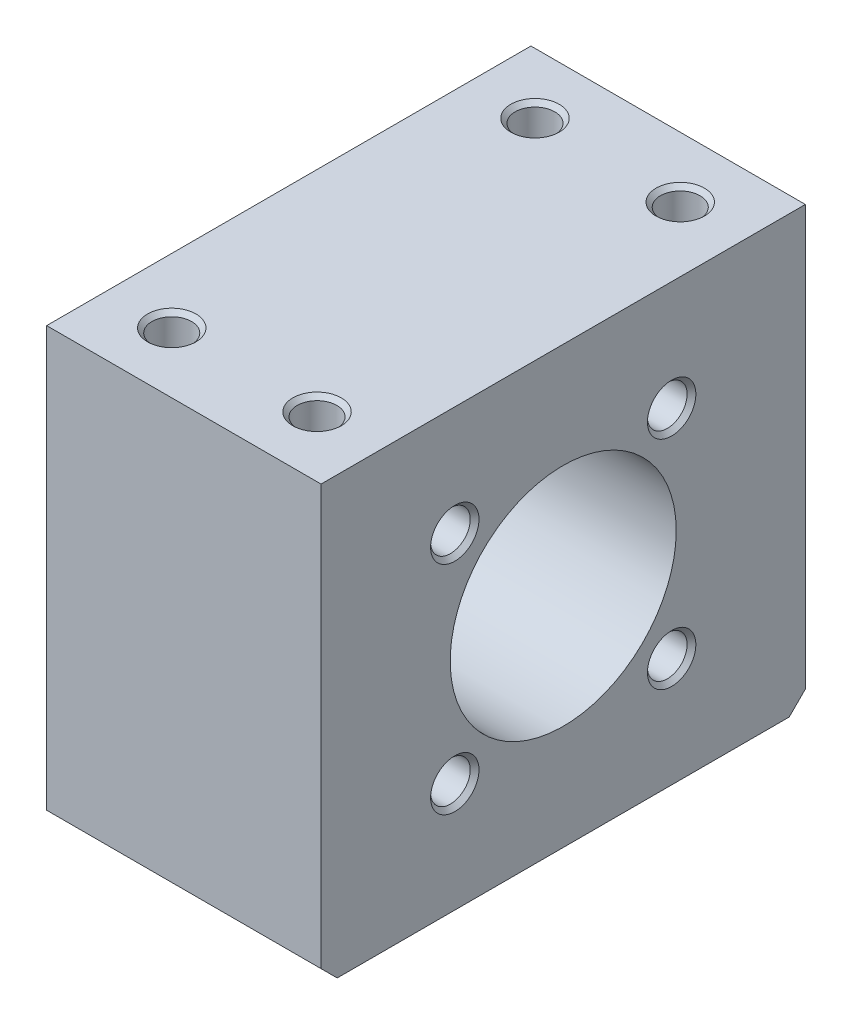
ISO-10303-21;
HEADER;
FILE_DESCRIPTION(('STEP AP214'),'2;1');
FILE_NAME('part.step','',(''),(''),'','','');
FILE_SCHEMA(('AUTOMOTIVE_DESIGN { 1 0 10303 214 1 1 1 1 }'));
ENDSEC;
DATA;
#1=APPLICATION_CONTEXT('core data for automotive mechanical design processes');
#2=APPLICATION_PROTOCOL_DEFINITION('international standard','automotive_design',2000,#1);
#3=PRODUCT_CONTEXT('',#1,'mechanical');
#4=PRODUCT('Part','Part','',(#3));
#5=PRODUCT_RELATED_PRODUCT_CATEGORY('part','',(#4));
#6=PRODUCT_DEFINITION_FORMATION('','',#4);
#7=PRODUCT_DEFINITION_CONTEXT('part definition',#1,'design');
#8=PRODUCT_DEFINITION('design','',#6,#7);
#9=PRODUCT_DEFINITION_SHAPE('','',#8);
#10=(LENGTH_UNIT() NAMED_UNIT(*) SI_UNIT(.MILLI.,.METRE.));
#11=(NAMED_UNIT(*) PLANE_ANGLE_UNIT() SI_UNIT($,.RADIAN.));
#12=(NAMED_UNIT(*) SI_UNIT($,.STERADIAN.) SOLID_ANGLE_UNIT());
#13=UNCERTAINTY_MEASURE_WITH_UNIT(LENGTH_MEASURE(1.E-05),#10,'distance_accuracy_value','');
#14=(GEOMETRIC_REPRESENTATION_CONTEXT(3) GLOBAL_UNCERTAINTY_ASSIGNED_CONTEXT((#13)) GLOBAL_UNIT_ASSIGNED_CONTEXT((#10,
#11,#12)) REPRESENTATION_CONTEXT('',''));
#15=CARTESIAN_POINT('',(0.,0.,0.));
#16=DIRECTION('',(0.,0.,1.));
#17=DIRECTION('',(1.,0.,0.));
#18=AXIS2_PLACEMENT_3D('',#15,#16,#17);
#19=CARTESIAN_POINT('',(-17.,-27.,30.));
#20=DIRECTION('',(0.,-1.,0.));
#21=DIRECTION('',(0.,0.,-1.));
#22=AXIS2_PLACEMENT_3D('',#19,#20,#21);
#23=PLANE('',#22);
#24=DIRECTION('',(0.,0.,-1.));
#25=VECTOR('',#24,1.);
#26=CARTESIAN_POINT('',(17.,-27.,30.));
#27=LINE('',#26,#25);
#28=CARTESIAN_POINT('',(17.,-27.,28.));
#29=VERTEX_POINT('',#28);
#30=CARTESIAN_POINT('',(17.,-27.,-28.));
#31=VERTEX_POINT('',#30);
#32=EDGE_CURVE('E149',#29,#31,#27,.T.);
#33=ORIENTED_EDGE('',*,*,#32,.F.);
#34=DIRECTION('',(-1.,0.,0.));
#35=VECTOR('',#34,1.);
#36=CARTESIAN_POINT('',(-17.,-27.,28.));
#37=LINE('',#36,#35);
#38=CARTESIAN_POINT('',(-17.,-27.,28.));
#39=VERTEX_POINT('',#38);
#40=EDGE_CURVE('E233',#29,#39,#37,.T.);
#41=ORIENTED_EDGE('',*,*,#40,.T.);
#42=DIRECTION('',(0.,0.,-1.));
#43=VECTOR('',#42,1.);
#44=CARTESIAN_POINT('',(-17.,-27.,30.));
#45=LINE('',#44,#43);
#46=CARTESIAN_POINT('',(-17.,-27.,-28.));
#47=VERTEX_POINT('',#46);
#48=EDGE_CURVE('E150',#39,#47,#45,.T.);
#49=ORIENTED_EDGE('',*,*,#48,.T.);
#50=DIRECTION('',(1.,0.,0.));
#51=VECTOR('',#50,1.);
#52=CARTESIAN_POINT('',(-17.,-27.,-28.));
#53=LINE('',#52,#51);
#54=EDGE_CURVE('E230',#47,#31,#53,.T.);
#55=ORIENTED_EDGE('',*,*,#54,.T.);
#56=EDGE_LOOP('',(#33,#41,#49,#55));
#57=FACE_BOUND('',#56,.T.);
#58=ADVANCED_FACE('F35',(#57),#23,.T.);
#59=CARTESIAN_POINT('',(-17.,27.,30.));
#60=DIRECTION('',(0.,0.,1.));
#61=DIRECTION('',(1.,0.,0.));
#62=AXIS2_PLACEMENT_3D('',#59,#60,#61);
#63=PLANE('',#62);
#64=DIRECTION('',(0.,-1.,0.));
#65=VECTOR('',#64,1.);
#66=CARTESIAN_POINT('',(-17.,27.,30.));
#67=LINE('',#66,#65);
#68=CARTESIAN_POINT('',(-17.,27.,30.));
#69=VERTEX_POINT('',#68);
#70=CARTESIAN_POINT('',(-17.,-25.,30.));
#71=VERTEX_POINT('',#70);
#72=EDGE_CURVE('E158',#69,#71,#67,.T.);
#73=ORIENTED_EDGE('',*,*,#72,.T.);
#74=DIRECTION('',(1.,0.,0.));
#75=VECTOR('',#74,1.);
#76=CARTESIAN_POINT('',(-17.,-25.,30.));
#77=LINE('',#76,#75);
#78=CARTESIAN_POINT('',(17.,-25.,30.));
#79=VERTEX_POINT('',#78);
#80=EDGE_CURVE('E223',#71,#79,#77,.T.);
#81=ORIENTED_EDGE('',*,*,#80,.T.);
#82=DIRECTION('',(0.,-1.,0.));
#83=VECTOR('',#82,1.);
#84=CARTESIAN_POINT('',(17.,27.,30.));
#85=LINE('',#84,#83);
#86=CARTESIAN_POINT('',(17.,27.,30.));
#87=VERTEX_POINT('',#86);
#88=EDGE_CURVE('E153',#87,#79,#85,.T.);
#89=ORIENTED_EDGE('',*,*,#88,.F.);
#90=DIRECTION('',(1.,0.,0.));
#91=VECTOR('',#90,1.);
#92=CARTESIAN_POINT('',(-17.,27.,30.));
#93=LINE('',#92,#91);
#94=EDGE_CURVE('E171',#69,#87,#93,.T.);
#95=ORIENTED_EDGE('',*,*,#94,.F.);
#96=EDGE_LOOP('',(#73,#81,#89,#95));
#97=FACE_BOUND('',#96,.T.);
#98=ADVANCED_FACE('F243',(#97),#63,.T.);
#99=CARTESIAN_POINT('',(-17.,27.,-30.));
#100=DIRECTION('',(0.,1.,0.));
#101=DIRECTION('',(0.,0.,1.));
#102=AXIS2_PLACEMENT_3D('',#99,#100,#101);
#103=PLANE('',#102);
#104=CARTESIAN_POINT('',(-9.,27.,22.5));
#105=DIRECTION('',(0.,1.,0.));
#106=DIRECTION('',(0.,0.,1.));
#107=AXIS2_PLACEMENT_3D('',#104,#105,#106);
#108=CIRCLE('',#107,3.00000000005393);
#109=CARTESIAN_POINT('',(-9.,27.,25.5000000000539));
#110=VERTEX_POINT('',#109);
#111=EDGE_CURVE('E187',#110,#110,#108,.F.);
#112=ORIENTED_EDGE('',*,*,#111,.T.);
#113=EDGE_LOOP('',(#112));
#114=FACE_BOUND('',#113,.T.);
#115=CARTESIAN_POINT('',(9.,27.,22.5));
#116=DIRECTION('',(0.,1.,0.));
#117=DIRECTION('',(0.,0.,1.));
#118=AXIS2_PLACEMENT_3D('',#115,#116,#117);
#119=CIRCLE('',#118,3.00000000005393);
#120=CARTESIAN_POINT('',(9.,27.,25.5000000000539));
#121=VERTEX_POINT('',#120);
#122=EDGE_CURVE('E184',#121,#121,#119,.F.);
#123=ORIENTED_EDGE('',*,*,#122,.T.);
#124=EDGE_LOOP('',(#123));
#125=FACE_BOUND('',#124,.T.);
#126=CARTESIAN_POINT('',(-9.,27.,-22.5));
#127=DIRECTION('',(0.,1.,0.));
#128=DIRECTION('',(0.,0.,1.));
#129=AXIS2_PLACEMENT_3D('',#126,#127,#128);
#130=CIRCLE('',#129,3.00000000005393);
#131=CARTESIAN_POINT('',(-9.,27.,-19.4999999999461));
#132=VERTEX_POINT('',#131);
#133=EDGE_CURVE('E181',#132,#132,#130,.F.);
#134=ORIENTED_EDGE('',*,*,#133,.T.);
#135=EDGE_LOOP('',(#134));
#136=FACE_BOUND('',#135,.T.);
#137=CARTESIAN_POINT('',(9.,27.,-22.5));
#138=DIRECTION('',(0.,1.,0.));
#139=DIRECTION('',(0.,0.,1.));
#140=AXIS2_PLACEMENT_3D('',#137,#138,#139);
#141=CIRCLE('',#140,3.00000000005393);
#142=CARTESIAN_POINT('',(9.,27.,-19.4999999999461));
#143=VERTEX_POINT('',#142);
#144=EDGE_CURVE('E178',#143,#143,#141,.F.);
#145=ORIENTED_EDGE('',*,*,#144,.T.);
#146=EDGE_LOOP('',(#145));
#147=FACE_BOUND('',#146,.T.);
#148=DIRECTION('',(0.,0.,1.));
#149=VECTOR('',#148,1.);
#150=CARTESIAN_POINT('',(17.,27.,-30.));
#151=LINE('',#150,#149);
#152=CARTESIAN_POINT('',(17.,27.,-30.));
#153=VERTEX_POINT('',#152);
#154=EDGE_CURVE('E166',#153,#87,#151,.T.);
#155=ORIENTED_EDGE('',*,*,#154,.F.);
#156=DIRECTION('',(1.,0.,0.));
#157=VECTOR('',#156,1.);
#158=CARTESIAN_POINT('',(-17.,27.,-30.));
#159=LINE('',#158,#157);
#160=CARTESIAN_POINT('',(-17.,27.,-30.));
#161=VERTEX_POINT('',#160);
#162=EDGE_CURVE('E161',#161,#153,#159,.T.);
#163=ORIENTED_EDGE('',*,*,#162,.F.);
#164=DIRECTION('',(0.,0.,1.));
#165=VECTOR('',#164,1.);
#166=CARTESIAN_POINT('',(-17.,27.,-30.));
#167=LINE('',#166,#165);
#168=EDGE_CURVE('E155',#161,#69,#167,.T.);
#169=ORIENTED_EDGE('',*,*,#168,.T.);
#170=ORIENTED_EDGE('',*,*,#94,.T.);
#171=EDGE_LOOP('',(#155,#163,#169,#170));
#172=FACE_BOUND('',#171,.T.);
#173=ADVANCED_FACE('F256',(#114,#125,#136,#147,#172),#103,.T.);
#174=CARTESIAN_POINT('',(-17.,-27.,-30.));
#175=DIRECTION('',(0.,0.,-1.));
#176=DIRECTION('',(-1.,0.,0.));
#177=AXIS2_PLACEMENT_3D('',#174,#175,#176);
#178=PLANE('',#177);
#179=DIRECTION('',(0.,1.,0.));
#180=VECTOR('',#179,1.);
#181=CARTESIAN_POINT('',(17.,-27.,-30.));
#182=LINE('',#181,#180);
#183=CARTESIAN_POINT('',(17.,-25.,-30.));
#184=VERTEX_POINT('',#183);
#185=EDGE_CURVE('E164',#184,#153,#182,.T.);
#186=ORIENTED_EDGE('',*,*,#185,.F.);
#187=DIRECTION('',(-1.,0.,0.));
#188=VECTOR('',#187,1.);
#189=CARTESIAN_POINT('',(-17.,-25.,-30.));
#190=LINE('',#189,#188);
#191=CARTESIAN_POINT('',(-17.,-25.,-30.));
#192=VERTEX_POINT('',#191);
#193=EDGE_CURVE('E11',#184,#192,#190,.T.);
#194=ORIENTED_EDGE('',*,*,#193,.T.);
#195=DIRECTION('',(0.,1.,0.));
#196=VECTOR('',#195,1.);
#197=CARTESIAN_POINT('',(-17.,-27.,-30.));
#198=LINE('',#197,#196);
#199=EDGE_CURVE('E152',#192,#161,#198,.T.);
#200=ORIENTED_EDGE('',*,*,#199,.T.);
#201=ORIENTED_EDGE('',*,*,#162,.T.);
#202=EDGE_LOOP('',(#186,#194,#200,#201));
#203=FACE_BOUND('',#202,.T.);
#204=ADVANCED_FACE('F252',(#203),#178,.T.);
#205=CARTESIAN_POINT('',(-17.,0.,0.));
#206=DIRECTION('',(1.,0.,0.));
#207=DIRECTION('',(0.,0.,-1.));
#208=AXIS2_PLACEMENT_3D('',#205,#206,#207);
#209=PLANE('',#208);
#210=CARTESIAN_POINT('',(-17.,0.,0.));
#211=DIRECTION('',(1.,0.,0.));
#212=DIRECTION('',(0.,0.,-1.));
#213=AXIS2_PLACEMENT_3D('',#210,#211,#212);
#214=CIRCLE('',#213,14.);
#215=CARTESIAN_POINT('',(-17.,0.,-14.));
#216=VERTEX_POINT('',#215);
#217=EDGE_CURVE('E146',#216,#216,#214,.T.);
#218=ORIENTED_EDGE('',*,*,#217,.T.);
#219=EDGE_LOOP('',(#218));
#220=FACE_BOUND('',#219,.T.);
#221=ORIENTED_EDGE('',*,*,#48,.F.);
#222=DIRECTION('',(0.,-0.707106781186544,-0.707106781186551));
#223=VECTOR('',#222,1.);
#224=CARTESIAN_POINT('',(-17.,-25.,30.));
#225=LINE('',#224,#223);
#226=EDGE_CURVE('E43',#39,#71,#225,.F.);
#227=ORIENTED_EDGE('',*,*,#226,.T.);
#228=ORIENTED_EDGE('',*,*,#72,.F.);
#229=ORIENTED_EDGE('',*,*,#168,.F.);
#230=ORIENTED_EDGE('',*,*,#199,.F.);
#231=DIRECTION('',(0.,0.707106781186551,-0.707106781186544));
#232=VECTOR('',#231,1.);
#233=CARTESIAN_POINT('',(-17.,-27.,-28.));
#234=LINE('',#233,#232);
#235=EDGE_CURVE('E55',#192,#47,#234,.F.);
#236=ORIENTED_EDGE('',*,*,#235,.T.);
#237=EDGE_LOOP('',(#221,#227,#228,#229,#230,#236));
#238=FACE_BOUND('',#237,.T.);
#239=ADVANCED_FACE('F237',(#220,#238),#209,.F.);
#240=CARTESIAN_POINT('',(17.,0.,0.));
#241=DIRECTION('',(1.,0.,0.));
#242=DIRECTION('',(0.,0.,-1.));
#243=AXIS2_PLACEMENT_3D('',#240,#241,#242);
#244=PLANE('',#243);
#245=CARTESIAN_POINT('',(17.,-13.4350288425444,13.4350288425444));
#246=DIRECTION('',(1.,0.,0.));
#247=DIRECTION('',(0.,0.,-1.));
#248=AXIS2_PLACEMENT_3D('',#245,#246,#247);
#249=CIRCLE('',#248,3.00000000005394);
#250=CARTESIAN_POINT('',(17.,-13.4350288425444,10.4350288424905));
#251=VERTEX_POINT('',#250);
#252=EDGE_CURVE('E205',#251,#251,#249,.F.);
#253=ORIENTED_EDGE('',*,*,#252,.T.);
#254=EDGE_LOOP('',(#253));
#255=FACE_BOUND('',#254,.T.);
#256=CARTESIAN_POINT('',(17.,-13.4350288425444,-13.4350288425444));
#257=DIRECTION('',(1.,0.,0.));
#258=DIRECTION('',(0.,0.,-1.));
#259=AXIS2_PLACEMENT_3D('',#256,#257,#258);
#260=CIRCLE('',#259,3.00000000005392);
#261=CARTESIAN_POINT('',(17.,-13.4350288425444,-16.4350288425983));
#262=VERTEX_POINT('',#261);
#263=EDGE_CURVE('E202',#262,#262,#260,.F.);
#264=ORIENTED_EDGE('',*,*,#263,.T.);
#265=EDGE_LOOP('',(#264));
#266=FACE_BOUND('',#265,.T.);
#267=CARTESIAN_POINT('',(17.,13.4350288425444,13.4350288425444));
#268=DIRECTION('',(1.,0.,0.));
#269=DIRECTION('',(0.,0.,-1.));
#270=AXIS2_PLACEMENT_3D('',#267,#268,#269);
#271=CIRCLE('',#270,3.00000000005394);
#272=CARTESIAN_POINT('',(17.,13.4350288425444,10.4350288424905));
#273=VERTEX_POINT('',#272);
#274=EDGE_CURVE('E199',#273,#273,#271,.F.);
#275=ORIENTED_EDGE('',*,*,#274,.T.);
#276=EDGE_LOOP('',(#275));
#277=FACE_BOUND('',#276,.T.);
#278=CARTESIAN_POINT('',(17.,13.4350288425444,-13.4350288425444));
#279=DIRECTION('',(1.,0.,0.));
#280=DIRECTION('',(0.,0.,-1.));
#281=AXIS2_PLACEMENT_3D('',#278,#279,#280);
#282=CIRCLE('',#281,3.00000000005392);
#283=CARTESIAN_POINT('',(17.,13.4350288425444,-16.4350288425983));
#284=VERTEX_POINT('',#283);
#285=EDGE_CURVE('E196',#284,#284,#282,.F.);
#286=ORIENTED_EDGE('',*,*,#285,.T.);
#287=EDGE_LOOP('',(#286));
#288=FACE_BOUND('',#287,.T.);
#289=CARTESIAN_POINT('',(17.,0.,0.));
#290=DIRECTION('',(1.,0.,0.));
#291=DIRECTION('',(0.,0.,-1.));
#292=AXIS2_PLACEMENT_3D('',#289,#290,#291);
#293=CIRCLE('',#292,14.);
#294=CARTESIAN_POINT('',(17.,0.,-14.));
#295=VERTEX_POINT('',#294);
#296=EDGE_CURVE('E143',#295,#295,#293,.T.);
#297=ORIENTED_EDGE('',*,*,#296,.F.);
#298=EDGE_LOOP('',(#297));
#299=FACE_BOUND('',#298,.T.);
#300=ORIENTED_EDGE('',*,*,#88,.T.);
#301=DIRECTION('',(0.,0.707106781186544,0.707106781186551));
#302=VECTOR('',#301,1.);
#303=CARTESIAN_POINT('',(17.,-27.5000000000001,27.4999999999999));
#304=LINE('',#303,#302);
#305=EDGE_CURVE('E228',#79,#29,#304,.F.);
#306=ORIENTED_EDGE('',*,*,#305,.T.);
#307=ORIENTED_EDGE('',*,*,#32,.T.);
#308=DIRECTION('',(0.,-0.707106781186551,0.707106781186544));
#309=VECTOR('',#308,1.);
#310=CARTESIAN_POINT('',(17.,-27.4999999999999,-27.5000000000002));
#311=LINE('',#310,#309);
#312=EDGE_CURVE('E226',#31,#184,#311,.F.);
#313=ORIENTED_EDGE('',*,*,#312,.T.);
#314=ORIENTED_EDGE('',*,*,#185,.T.);
#315=ORIENTED_EDGE('',*,*,#154,.T.);
#316=EDGE_LOOP('',(#300,#306,#307,#313,#314,#315));
#317=FACE_BOUND('',#316,.T.);
#318=ADVANCED_FACE('F248',(#255,#266,#277,#288,#299,#317),#244,.T.);
#319=CARTESIAN_POINT('',(17.,0.,0.));
#320=DIRECTION('',(1.,0.,0.));
#321=DIRECTION('',(0.,0.,-1.));
#322=AXIS2_PLACEMENT_3D('',#319,#320,#321);
#323=CYLINDRICAL_SURFACE('',#322,14.);
#324=ORIENTED_EDGE('',*,*,#217,.F.);
#325=EDGE_LOOP('',(#324));
#326=FACE_BOUND('',#325,.T.);
#327=ORIENTED_EDGE('',*,*,#296,.T.);
#328=EDGE_LOOP('',(#327));
#329=FACE_BOUND('',#328,.T.);
#330=ADVANCED_FACE('F323',(#326,#329),#323,.F.);
#331=CARTESIAN_POINT('',(-9.,12.6873648292338,22.5));
#332=DIRECTION('',(0.,1.,0.));
#333=DIRECTION('',(0.,0.,1.));
#334=AXIS2_PLACEMENT_3D('',#331,#332,#333);
#335=CONICAL_SURFACE('',#334,2.4585,1.04719755108975);
#336=CARTESIAN_POINT('',(-9.,11.2679491920809,22.5));
#337=VERTEX_POINT('',#336);
#338=VERTEX_LOOP('',#337);
#339=FACE_BOUND('',#338,.T.);
#340=CARTESIAN_POINT('',(-9.,12.6873648292338,22.5));
#341=DIRECTION('',(0.,1.,0.));
#342=DIRECTION('',(0.,0.,1.));
#343=AXIS2_PLACEMENT_3D('',#340,#341,#342);
#344=CIRCLE('',#343,2.4585);
#345=CARTESIAN_POINT('',(-9.,12.6873648292338,24.9585));
#346=VERTEX_POINT('',#345);
#347=EDGE_CURVE('E140',#346,#346,#344,.T.);
#348=ORIENTED_EDGE('',*,*,#347,.T.);
#349=EDGE_LOOP('',(#348));
#350=FACE_BOUND('',#349,.T.);
#351=ADVANCED_FACE('F495',(#339,#350),#335,.F.);
#352=CARTESIAN_POINT('',(-9.,27.,22.5));
#353=DIRECTION('',(0.,1.,0.));
#354=DIRECTION('',(0.,0.,1.));
#355=AXIS2_PLACEMENT_3D('',#352,#353,#354);
#356=CYLINDRICAL_SURFACE('',#355,2.4585);
#357=CARTESIAN_POINT('',(-9.,26.4584999999461,22.5));
#358=DIRECTION('',(0.,1.,0.));
#359=DIRECTION('',(0.,0.,1.));
#360=AXIS2_PLACEMENT_3D('',#357,#358,#359);
#361=CIRCLE('',#360,2.4585);
#362=CARTESIAN_POINT('',(-9.,26.4584999999461,24.9585));
#363=VERTEX_POINT('',#362);
#364=EDGE_CURVE('E173',#363,#363,#361,.T.);
#365=ORIENTED_EDGE('',*,*,#364,.T.);
#366=EDGE_LOOP('',(#365));
#367=FACE_BOUND('',#366,.T.);
#368=ORIENTED_EDGE('',*,*,#347,.F.);
#369=EDGE_LOOP('',(#368));
#370=FACE_BOUND('',#369,.T.);
#371=ADVANCED_FACE('F491',(#367,#370),#356,.F.);
#372=CARTESIAN_POINT('',(-9.,12.6873648292338,-22.5));
#373=DIRECTION('',(0.,1.,0.));
#374=DIRECTION('',(0.,0.,1.));
#375=AXIS2_PLACEMENT_3D('',#372,#373,#374);
#376=CONICAL_SURFACE('',#375,2.4585,1.04719755108975);
#377=CARTESIAN_POINT('',(-9.,11.2679491920809,-22.5));
#378=VERTEX_POINT('',#377);
#379=VERTEX_LOOP('',#378);
#380=FACE_BOUND('',#379,.T.);
#381=CARTESIAN_POINT('',(-9.,12.6873648292338,-22.5));
#382=DIRECTION('',(0.,1.,0.));
#383=DIRECTION('',(0.,0.,1.));
#384=AXIS2_PLACEMENT_3D('',#381,#382,#383);
#385=CIRCLE('',#384,2.4585);
#386=CARTESIAN_POINT('',(-9.,12.6873648292338,-20.0415));
#387=VERTEX_POINT('',#386);
#388=EDGE_CURVE('E137',#387,#387,#385,.T.);
#389=ORIENTED_EDGE('',*,*,#388,.T.);
#390=EDGE_LOOP('',(#389));
#391=FACE_BOUND('',#390,.T.);
#392=ADVANCED_FACE('F483',(#380,#391),#376,.F.);
#393=CARTESIAN_POINT('',(-9.,27.,-22.5));
#394=DIRECTION('',(0.,1.,0.));
#395=DIRECTION('',(0.,0.,1.));
#396=AXIS2_PLACEMENT_3D('',#393,#394,#395);
#397=CYLINDRICAL_SURFACE('',#396,2.4585);
#398=CARTESIAN_POINT('',(-9.,26.4584999999461,-22.5));
#399=DIRECTION('',(0.,1.,0.));
#400=DIRECTION('',(0.,0.,1.));
#401=AXIS2_PLACEMENT_3D('',#398,#399,#400);
#402=CIRCLE('',#401,2.4585);
#403=CARTESIAN_POINT('',(-9.,26.4584999999461,-20.0415));
#404=VERTEX_POINT('',#403);
#405=EDGE_CURVE('E208',#404,#404,#402,.T.);
#406=ORIENTED_EDGE('',*,*,#405,.T.);
#407=EDGE_LOOP('',(#406));
#408=FACE_BOUND('',#407,.T.);
#409=ORIENTED_EDGE('',*,*,#388,.F.);
#410=EDGE_LOOP('',(#409));
#411=FACE_BOUND('',#410,.T.);
#412=ADVANCED_FACE('F478',(#408,#411),#397,.F.);
#413=CARTESIAN_POINT('',(9.,12.6873648292338,22.5));
#414=DIRECTION('',(0.,1.,0.));
#415=DIRECTION('',(0.,0.,1.));
#416=AXIS2_PLACEMENT_3D('',#413,#414,#415);
#417=CONICAL_SURFACE('',#416,2.4585,1.04719755108975);
#418=CARTESIAN_POINT('',(9.,11.2679491920809,22.5));
#419=VERTEX_POINT('',#418);
#420=VERTEX_LOOP('',#419);
#421=FACE_BOUND('',#420,.T.);
#422=CARTESIAN_POINT('',(9.,12.6873648292338,22.5));
#423=DIRECTION('',(0.,1.,0.));
#424=DIRECTION('',(0.,0.,1.));
#425=AXIS2_PLACEMENT_3D('',#422,#423,#424);
#426=CIRCLE('',#425,2.4585);
#427=CARTESIAN_POINT('',(9.,12.6873648292338,24.9585));
#428=VERTEX_POINT('',#427);
#429=EDGE_CURVE('E134',#428,#428,#426,.T.);
#430=ORIENTED_EDGE('',*,*,#429,.T.);
#431=EDGE_LOOP('',(#430));
#432=FACE_BOUND('',#431,.T.);
#433=ADVANCED_FACE('F470',(#421,#432),#417,.F.);
#434=CARTESIAN_POINT('',(9.,27.,22.5));
#435=DIRECTION('',(0.,1.,0.));
#436=DIRECTION('',(0.,0.,1.));
#437=AXIS2_PLACEMENT_3D('',#434,#435,#436);
#438=CYLINDRICAL_SURFACE('',#437,2.4585);
#439=CARTESIAN_POINT('',(9.,26.4584999999461,22.5));
#440=DIRECTION('',(0.,1.,0.));
#441=DIRECTION('',(0.,0.,1.));
#442=AXIS2_PLACEMENT_3D('',#439,#440,#441);
#443=CIRCLE('',#442,2.4585);
#444=CARTESIAN_POINT('',(9.,26.4584999999461,24.9585));
#445=VERTEX_POINT('',#444);
#446=EDGE_CURVE('E190',#445,#445,#443,.T.);
#447=ORIENTED_EDGE('',*,*,#446,.T.);
#448=EDGE_LOOP('',(#447));
#449=FACE_BOUND('',#448,.T.);
#450=ORIENTED_EDGE('',*,*,#429,.F.);
#451=EDGE_LOOP('',(#450));
#452=FACE_BOUND('',#451,.T.);
#453=ADVANCED_FACE('F465',(#449,#452),#438,.F.);
#454=CARTESIAN_POINT('',(9.,12.6873648292338,-22.5));
#455=DIRECTION('',(0.,1.,0.));
#456=DIRECTION('',(0.,0.,1.));
#457=AXIS2_PLACEMENT_3D('',#454,#455,#456);
#458=CONICAL_SURFACE('',#457,2.4585,1.04719755108975);
#459=CARTESIAN_POINT('',(9.,11.2679491920809,-22.5));
#460=VERTEX_POINT('',#459);
#461=VERTEX_LOOP('',#460);
#462=FACE_BOUND('',#461,.T.);
#463=CARTESIAN_POINT('',(9.,12.6873648292338,-22.5));
#464=DIRECTION('',(0.,1.,0.));
#465=DIRECTION('',(0.,0.,1.));
#466=AXIS2_PLACEMENT_3D('',#463,#464,#465);
#467=CIRCLE('',#466,2.4585);
#468=CARTESIAN_POINT('',(9.,12.6873648292338,-20.0415));
#469=VERTEX_POINT('',#468);
#470=EDGE_CURVE('E131',#469,#469,#467,.T.);
#471=ORIENTED_EDGE('',*,*,#470,.T.);
#472=EDGE_LOOP('',(#471));
#473=FACE_BOUND('',#472,.T.);
#474=ADVANCED_FACE('F457',(#462,#473),#458,.F.);
#475=CARTESIAN_POINT('',(9.,27.,-22.5));
#476=DIRECTION('',(0.,1.,0.));
#477=DIRECTION('',(0.,0.,1.));
#478=AXIS2_PLACEMENT_3D('',#475,#476,#477);
#479=CYLINDRICAL_SURFACE('',#478,2.4585);
#480=CARTESIAN_POINT('',(9.,26.4584999999461,-22.5));
#481=DIRECTION('',(0.,1.,0.));
#482=DIRECTION('',(0.,0.,1.));
#483=AXIS2_PLACEMENT_3D('',#480,#481,#482);
#484=CIRCLE('',#483,2.4585);
#485=CARTESIAN_POINT('',(9.,26.4584999999461,-20.0415));
#486=VERTEX_POINT('',#485);
#487=EDGE_CURVE('E220',#486,#486,#484,.T.);
#488=ORIENTED_EDGE('',*,*,#487,.T.);
#489=EDGE_LOOP('',(#488));
#490=FACE_BOUND('',#489,.T.);
#491=ORIENTED_EDGE('',*,*,#470,.F.);
#492=EDGE_LOOP('',(#491));
#493=FACE_BOUND('',#492,.T.);
#494=ADVANCED_FACE('F452',(#490,#493),#479,.F.);
#495=CARTESIAN_POINT('',(4.68736482923382,13.4350288425444,13.4350288425444));
#496=DIRECTION('',(1.,0.,0.));
#497=DIRECTION('',(0.,0.,-1.));
#498=AXIS2_PLACEMENT_3D('',#495,#496,#497);
#499=CONICAL_SURFACE('',#498,2.4585,1.04719755105556);
#500=CARTESIAN_POINT('',(3.26794919196881,13.4350288425444,13.4350288425444));
#501=VERTEX_POINT('',#500);
#502=VERTEX_LOOP('',#501);
#503=FACE_BOUND('',#502,.T.);
#504=CARTESIAN_POINT('',(4.68736482923382,13.4350288425444,13.4350288425444));
#505=DIRECTION('',(1.,0.,0.));
#506=DIRECTION('',(0.,0.,-1.));
#507=AXIS2_PLACEMENT_3D('',#504,#505,#506);
#508=CIRCLE('',#507,2.4585);
#509=CARTESIAN_POINT('',(4.68736482923382,13.4350288425444,10.9765288425444));
#510=VERTEX_POINT('',#509);
#511=EDGE_CURVE('E128',#510,#510,#508,.T.);
#512=ORIENTED_EDGE('',*,*,#511,.T.);
#513=EDGE_LOOP('',(#512));
#514=FACE_BOUND('',#513,.T.);
#515=ADVANCED_FACE('F444',(#503,#514),#499,.F.);
#516=CARTESIAN_POINT('',(17.,13.4350288425444,13.4350288425444));
#517=DIRECTION('',(1.,0.,0.));
#518=DIRECTION('',(0.,0.,-1.));
#519=AXIS2_PLACEMENT_3D('',#516,#517,#518);
#520=CYLINDRICAL_SURFACE('',#519,2.4585);
#521=CARTESIAN_POINT('',(16.4584999999461,13.4350288425444,13.4350288425444));
#522=DIRECTION('',(1.,0.,0.));
#523=DIRECTION('',(0.,0.,-1.));
#524=AXIS2_PLACEMENT_3D('',#521,#522,#523);
#525=CIRCLE('',#524,2.4585);
#526=CARTESIAN_POINT('',(16.4584999999461,13.4350288425444,10.9765288425444));
#527=VERTEX_POINT('',#526);
#528=EDGE_CURVE('E214',#527,#527,#525,.T.);
#529=ORIENTED_EDGE('',*,*,#528,.T.);
#530=EDGE_LOOP('',(#529));
#531=FACE_BOUND('',#530,.T.);
#532=ORIENTED_EDGE('',*,*,#511,.F.);
#533=EDGE_LOOP('',(#532));
#534=FACE_BOUND('',#533,.T.);
#535=ADVANCED_FACE('F439',(#531,#534),#520,.F.);
#536=CARTESIAN_POINT('',(4.68736482923382,-13.4350288425444,-13.4350288425444));
#537=DIRECTION('',(1.,0.,0.));
#538=DIRECTION('',(0.,0.,-1.));
#539=AXIS2_PLACEMENT_3D('',#536,#537,#538);
#540=CONICAL_SURFACE('',#539,2.4585,1.04719755105556);
#541=CARTESIAN_POINT('',(3.26794919196881,-13.4350288425444,-13.4350288425444));
#542=VERTEX_POINT('',#541);
#543=VERTEX_LOOP('',#542);
#544=FACE_BOUND('',#543,.T.);
#545=CARTESIAN_POINT('',(4.68736482923382,-13.4350288425444,-13.4350288425444));
#546=DIRECTION('',(1.,0.,0.));
#547=DIRECTION('',(0.,0.,-1.));
#548=AXIS2_PLACEMENT_3D('',#545,#546,#547);
#549=CIRCLE('',#548,2.4585);
#550=CARTESIAN_POINT('',(4.68736482923382,-13.4350288425444,-15.8935288425444));
#551=VERTEX_POINT('',#550);
#552=EDGE_CURVE('E123',#551,#551,#549,.T.);
#553=ORIENTED_EDGE('',*,*,#552,.T.);
#554=EDGE_LOOP('',(#553));
#555=FACE_BOUND('',#554,.T.);
#556=ADVANCED_FACE('F431',(#544,#555),#540,.F.);
#557=CARTESIAN_POINT('',(17.,-13.4350288425444,-13.4350288425444));
#558=DIRECTION('',(1.,0.,0.));
#559=DIRECTION('',(0.,0.,-1.));
#560=AXIS2_PLACEMENT_3D('',#557,#558,#559);
#561=CYLINDRICAL_SURFACE('',#560,2.4585);
#562=CARTESIAN_POINT('',(16.4584999999461,-13.4350288425444,-13.4350288425444));
#563=DIRECTION('',(1.,0.,0.));
#564=DIRECTION('',(0.,0.,-1.));
#565=AXIS2_PLACEMENT_3D('',#562,#563,#564);
#566=CIRCLE('',#565,2.4585);
#567=CARTESIAN_POINT('',(16.4584999999461,-13.4350288425444,-15.8935288425444));
#568=VERTEX_POINT('',#567);
#569=EDGE_CURVE('E211',#568,#568,#566,.T.);
#570=ORIENTED_EDGE('',*,*,#569,.T.);
#571=EDGE_LOOP('',(#570));
#572=FACE_BOUND('',#571,.T.);
#573=ORIENTED_EDGE('',*,*,#552,.F.);
#574=EDGE_LOOP('',(#573));
#575=FACE_BOUND('',#574,.T.);
#576=ADVANCED_FACE('F426',(#572,#575),#561,.F.);
#577=CARTESIAN_POINT('',(4.68736482923382,-13.4350288425444,13.4350288425444));
#578=DIRECTION('',(1.,0.,0.));
#579=DIRECTION('',(0.,0.,-1.));
#580=AXIS2_PLACEMENT_3D('',#577,#578,#579);
#581=CONICAL_SURFACE('',#580,2.4585,1.04719755105556);
#582=CARTESIAN_POINT('',(3.26794919196881,-13.4350288425444,13.4350288425444));
#583=VERTEX_POINT('',#582);
#584=VERTEX_LOOP('',#583);
#585=FACE_BOUND('',#584,.T.);
#586=CARTESIAN_POINT('',(4.68736482923382,-13.4350288425444,13.4350288425444));
#587=DIRECTION('',(1.,0.,0.));
#588=DIRECTION('',(0.,0.,-1.));
#589=AXIS2_PLACEMENT_3D('',#586,#587,#588);
#590=CIRCLE('',#589,2.4585);
#591=CARTESIAN_POINT('',(4.68736482923382,-13.4350288425444,10.9765288425444));
#592=VERTEX_POINT('',#591);
#593=EDGE_CURVE('E120',#592,#592,#590,.T.);
#594=ORIENTED_EDGE('',*,*,#593,.T.);
#595=EDGE_LOOP('',(#594));
#596=FACE_BOUND('',#595,.T.);
#597=ADVANCED_FACE('F418',(#585,#596),#581,.F.);
#598=CARTESIAN_POINT('',(17.,-13.4350288425444,13.4350288425444));
#599=DIRECTION('',(1.,0.,0.));
#600=DIRECTION('',(0.,0.,-1.));
#601=AXIS2_PLACEMENT_3D('',#598,#599,#600);
#602=CYLINDRICAL_SURFACE('',#601,2.4585);
#603=CARTESIAN_POINT('',(16.4584999999461,-13.4350288425444,13.4350288425444));
#604=DIRECTION('',(1.,0.,0.));
#605=DIRECTION('',(0.,0.,-1.));
#606=AXIS2_PLACEMENT_3D('',#603,#604,#605);
#607=CIRCLE('',#606,2.4585);
#608=CARTESIAN_POINT('',(16.4584999999461,-13.4350288425444,10.9765288425444));
#609=VERTEX_POINT('',#608);
#610=EDGE_CURVE('E193',#609,#609,#607,.T.);
#611=ORIENTED_EDGE('',*,*,#610,.T.);
#612=EDGE_LOOP('',(#611));
#613=FACE_BOUND('',#612,.T.);
#614=ORIENTED_EDGE('',*,*,#593,.F.);
#615=EDGE_LOOP('',(#614));
#616=FACE_BOUND('',#615,.T.);
#617=ADVANCED_FACE('F114',(#613,#616),#602,.F.);
#618=CARTESIAN_POINT('',(4.68736482923382,13.4350288425444,-13.4350288425444));
#619=DIRECTION('',(1.,0.,0.));
#620=DIRECTION('',(0.,0.,-1.));
#621=AXIS2_PLACEMENT_3D('',#618,#619,#620);
#622=CONICAL_SURFACE('',#621,2.4585,1.04719755105556);
#623=CARTESIAN_POINT('',(3.26794919196881,13.4350288425444,-13.4350288425444));
#624=VERTEX_POINT('',#623);
#625=VERTEX_LOOP('',#624);
#626=FACE_BOUND('',#625,.T.);
#627=CARTESIAN_POINT('',(4.68736482923382,13.4350288425444,-13.4350288425444));
#628=DIRECTION('',(1.,0.,0.));
#629=DIRECTION('',(0.,0.,-1.));
#630=AXIS2_PLACEMENT_3D('',#627,#628,#629);
#631=CIRCLE('',#630,2.4585);
#632=CARTESIAN_POINT('',(4.68736482923382,13.4350288425444,-15.8935288425444));
#633=VERTEX_POINT('',#632);
#634=EDGE_CURVE('E118',#633,#633,#631,.T.);
#635=ORIENTED_EDGE('',*,*,#634,.T.);
#636=EDGE_LOOP('',(#635));
#637=FACE_BOUND('',#636,.T.);
#638=ADVANCED_FACE('F110',(#626,#637),#622,.F.);
#639=CARTESIAN_POINT('',(17.,13.4350288425444,-13.4350288425444));
#640=DIRECTION('',(1.,0.,0.));
#641=DIRECTION('',(0.,0.,-1.));
#642=AXIS2_PLACEMENT_3D('',#639,#640,#641);
#643=CYLINDRICAL_SURFACE('',#642,2.4585);
#644=CARTESIAN_POINT('',(16.4584999999461,13.4350288425444,-13.4350288425444));
#645=DIRECTION('',(1.,0.,0.));
#646=DIRECTION('',(0.,0.,-1.));
#647=AXIS2_PLACEMENT_3D('',#644,#645,#646);
#648=CIRCLE('',#647,2.4585);
#649=CARTESIAN_POINT('',(16.4584999999461,13.4350288425444,-15.8935288425444));
#650=VERTEX_POINT('',#649);
#651=EDGE_CURVE('E217',#650,#650,#648,.T.);
#652=ORIENTED_EDGE('',*,*,#651,.T.);
#653=EDGE_LOOP('',(#652));
#654=FACE_BOUND('',#653,.T.);
#655=ORIENTED_EDGE('',*,*,#634,.F.);
#656=EDGE_LOOP('',(#655));
#657=FACE_BOUND('',#656,.T.);
#658=ADVANCED_FACE('F113',(#654,#657),#643,.F.);
#659=CARTESIAN_POINT('',(-9.,26.4584999999461,22.5));
#660=DIRECTION('',(0.,1.,0.));
#661=DIRECTION('',(0.,0.,1.));
#662=AXIS2_PLACEMENT_3D('',#659,#660,#661);
#663=CONICAL_SURFACE('',#662,2.4585,0.785398163397459);
#664=ORIENTED_EDGE('',*,*,#111,.F.);
#665=EDGE_LOOP('',(#664));
#666=FACE_BOUND('',#665,.T.);
#667=ORIENTED_EDGE('',*,*,#364,.F.);
#668=EDGE_LOOP('',(#667));
#669=FACE_BOUND('',#668,.T.);
#670=ADVANCED_FACE('F272',(#666,#669),#663,.F.);
#671=CARTESIAN_POINT('',(9.,26.4584999999461,22.5));
#672=DIRECTION('',(0.,1.,0.));
#673=DIRECTION('',(0.,0.,1.));
#674=AXIS2_PLACEMENT_3D('',#671,#672,#673);
#675=CONICAL_SURFACE('',#674,2.4585,0.785398163397459);
#676=ORIENTED_EDGE('',*,*,#122,.F.);
#677=EDGE_LOOP('',(#676));
#678=FACE_BOUND('',#677,.T.);
#679=ORIENTED_EDGE('',*,*,#446,.F.);
#680=EDGE_LOOP('',(#679));
#681=FACE_BOUND('',#680,.T.);
#682=ADVANCED_FACE('F275',(#678,#681),#675,.F.);
#683=CARTESIAN_POINT('',(16.4584999999461,-13.4350288425444,13.4350288425444));
#684=DIRECTION('',(1.,0.,0.));
#685=DIRECTION('',(0.,0.,-1.));
#686=AXIS2_PLACEMENT_3D('',#683,#684,#685);
#687=CONICAL_SURFACE('',#686,2.4585,0.785398163397452);
#688=ORIENTED_EDGE('',*,*,#252,.F.);
#689=EDGE_LOOP('',(#688));
#690=FACE_BOUND('',#689,.T.);
#691=ORIENTED_EDGE('',*,*,#610,.F.);
#692=EDGE_LOOP('',(#691));
#693=FACE_BOUND('',#692,.T.);
#694=ADVANCED_FACE('F279',(#690,#693),#687,.F.);
#695=CARTESIAN_POINT('',(-9.,26.4584999999461,-22.5));
#696=DIRECTION('',(0.,1.,0.));
#697=DIRECTION('',(0.,0.,1.));
#698=AXIS2_PLACEMENT_3D('',#695,#696,#697);
#699=CONICAL_SURFACE('',#698,2.4585,0.785398163397459);
#700=ORIENTED_EDGE('',*,*,#133,.F.);
#701=EDGE_LOOP('',(#700));
#702=FACE_BOUND('',#701,.T.);
#703=ORIENTED_EDGE('',*,*,#405,.F.);
#704=EDGE_LOOP('',(#703));
#705=FACE_BOUND('',#704,.T.);
#706=ADVANCED_FACE('F283',(#702,#705),#699,.F.);
#707=CARTESIAN_POINT('',(16.4584999999461,-13.4350288425444,-13.4350288425444));
#708=DIRECTION('',(1.,0.,0.));
#709=DIRECTION('',(0.,0.,-1.));
#710=AXIS2_PLACEMENT_3D('',#707,#708,#709);
#711=CONICAL_SURFACE('',#710,2.4585,0.785398163397465);
#712=ORIENTED_EDGE('',*,*,#263,.F.);
#713=EDGE_LOOP('',(#712));
#714=FACE_BOUND('',#713,.T.);
#715=ORIENTED_EDGE('',*,*,#569,.F.);
#716=EDGE_LOOP('',(#715));
#717=FACE_BOUND('',#716,.T.);
#718=ADVANCED_FACE('F287',(#714,#717),#711,.F.);
#719=CARTESIAN_POINT('',(16.4584999999461,13.4350288425444,13.4350288425444));
#720=DIRECTION('',(1.,0.,0.));
#721=DIRECTION('',(0.,0.,-1.));
#722=AXIS2_PLACEMENT_3D('',#719,#720,#721);
#723=CONICAL_SURFACE('',#722,2.4585,0.785398163397451);
#724=ORIENTED_EDGE('',*,*,#274,.F.);
#725=EDGE_LOOP('',(#724));
#726=FACE_BOUND('',#725,.T.);
#727=ORIENTED_EDGE('',*,*,#528,.F.);
#728=EDGE_LOOP('',(#727));
#729=FACE_BOUND('',#728,.T.);
#730=ADVANCED_FACE('F291',(#726,#729),#723,.F.);
#731=CARTESIAN_POINT('',(16.4584999999461,13.4350288425444,-13.4350288425444));
#732=DIRECTION('',(1.,0.,0.));
#733=DIRECTION('',(0.,0.,-1.));
#734=AXIS2_PLACEMENT_3D('',#731,#732,#733);
#735=CONICAL_SURFACE('',#734,2.4585,0.785398163397464);
#736=ORIENTED_EDGE('',*,*,#285,.F.);
#737=EDGE_LOOP('',(#736));
#738=FACE_BOUND('',#737,.T.);
#739=ORIENTED_EDGE('',*,*,#651,.F.);
#740=EDGE_LOOP('',(#739));
#741=FACE_BOUND('',#740,.T.);
#742=ADVANCED_FACE('F295',(#738,#741),#735,.F.);
#743=CARTESIAN_POINT('',(9.,26.4584999999461,-22.5));
#744=DIRECTION('',(0.,1.,0.));
#745=DIRECTION('',(0.,0.,1.));
#746=AXIS2_PLACEMENT_3D('',#743,#744,#745);
#747=CONICAL_SURFACE('',#746,2.4585,0.785398163397459);
#748=ORIENTED_EDGE('',*,*,#144,.F.);
#749=EDGE_LOOP('',(#748));
#750=FACE_BOUND('',#749,.T.);
#751=ORIENTED_EDGE('',*,*,#487,.F.);
#752=EDGE_LOOP('',(#751));
#753=FACE_BOUND('',#752,.T.);
#754=ADVANCED_FACE('F299',(#750,#753),#747,.F.);
#755=CARTESIAN_POINT('',(-17.,-25.,30.));
#756=DIRECTION('',(0.,0.707106781186551,-0.707106781186544));
#757=DIRECTION('',(1.,0.,0.));
#758=AXIS2_PLACEMENT_3D('',#755,#756,#757);
#759=PLANE('',#758);
#760=ORIENTED_EDGE('',*,*,#226,.F.);
#761=ORIENTED_EDGE('',*,*,#40,.F.);
#762=ORIENTED_EDGE('',*,*,#305,.F.);
#763=ORIENTED_EDGE('',*,*,#80,.F.);
#764=EDGE_LOOP('',(#760,#761,#762,#763));
#765=FACE_BOUND('',#764,.T.);
#766=ADVANCED_FACE('F245',(#765),#759,.F.);
#767=CARTESIAN_POINT('',(-17.,-27.,-28.));
#768=DIRECTION('',(0.,0.707106781186544,0.707106781186551));
#769=DIRECTION('',(1.,0.,0.));
#770=AXIS2_PLACEMENT_3D('',#767,#768,#769);
#771=PLANE('',#770);
#772=ORIENTED_EDGE('',*,*,#235,.F.);
#773=ORIENTED_EDGE('',*,*,#193,.F.);
#774=ORIENTED_EDGE('',*,*,#312,.F.);
#775=ORIENTED_EDGE('',*,*,#54,.F.);
#776=EDGE_LOOP('',(#772,#773,#774,#775));
#777=FACE_BOUND('',#776,.T.);
#778=ADVANCED_FACE('F37',(#777),#771,.F.);
#779=CLOSED_SHELL('',(#58,#98,#173,#204,#239,#318,#330,#351,#371,#392,#412,#433,#453,#474,#494,
#515,#535,#556,#576,#597,#617,#638,#658,#670,#682,#694,#706,#718,#730,#742,#754,#766,#778));
#780=MANIFOLD_SOLID_BREP('B2',#779);
#781=ADVANCED_BREP_SHAPE_REPRESENTATION('',(#18,#780),#14);
#782=SHAPE_DEFINITION_REPRESENTATION(#9,#781);
ENDSEC;
END-ISO-10303-21;
